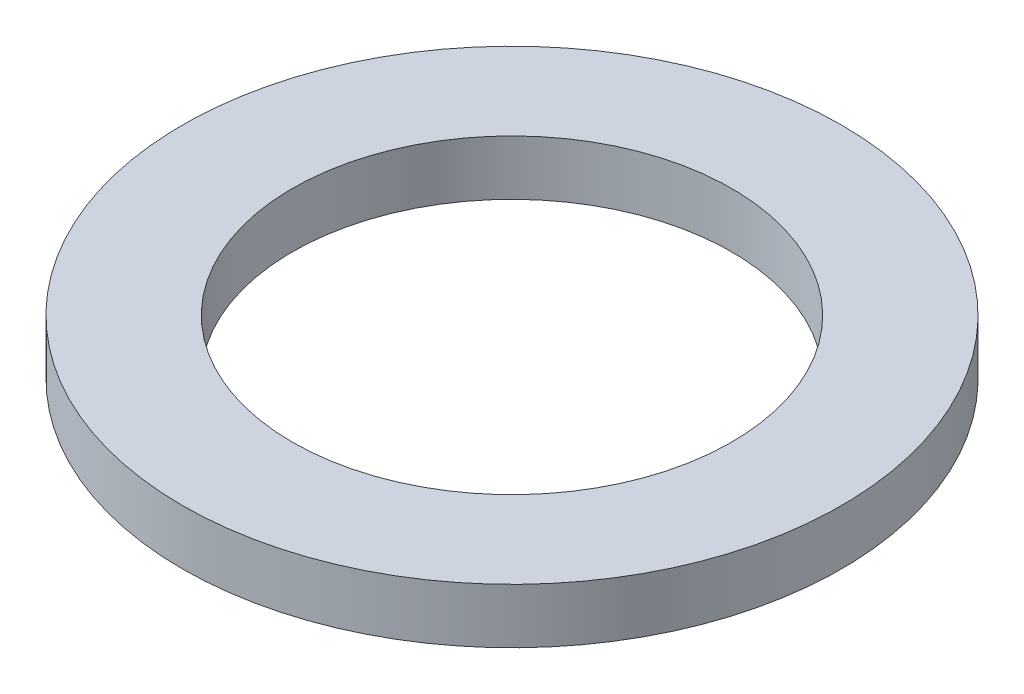
ISO-10303-21;
HEADER;
FILE_DESCRIPTION(('STEP AP214'),'2;1');
FILE_NAME('part.step','',(''),(''),'','','');
FILE_SCHEMA(('AUTOMOTIVE_DESIGN { 1 0 10303 214 1 1 1 1 }'));
ENDSEC;
DATA;
#1=APPLICATION_CONTEXT('core data for automotive mechanical design processes');
#2=APPLICATION_PROTOCOL_DEFINITION('international standard','automotive_design',2000,#1);
#3=PRODUCT_CONTEXT('',#1,'mechanical');
#4=PRODUCT('Part','Part','',(#3));
#5=PRODUCT_RELATED_PRODUCT_CATEGORY('part','',(#4));
#6=PRODUCT_DEFINITION_FORMATION('','',#4);
#7=PRODUCT_DEFINITION_CONTEXT('part definition',#1,'design');
#8=PRODUCT_DEFINITION('design','',#6,#7);
#9=PRODUCT_DEFINITION_SHAPE('','',#8);
#10=(LENGTH_UNIT() NAMED_UNIT(*) SI_UNIT(.MILLI.,.METRE.));
#11=(NAMED_UNIT(*) PLANE_ANGLE_UNIT() SI_UNIT($,.RADIAN.));
#12=(NAMED_UNIT(*) SI_UNIT($,.STERADIAN.) SOLID_ANGLE_UNIT());
#13=UNCERTAINTY_MEASURE_WITH_UNIT(LENGTH_MEASURE(1.E-05),#10,'distance_accuracy_value','');
#14=(GEOMETRIC_REPRESENTATION_CONTEXT(3) GLOBAL_UNCERTAINTY_ASSIGNED_CONTEXT((#13)) GLOBAL_UNIT_ASSIGNED_CONTEXT((#10,
#11,#12)) REPRESENTATION_CONTEXT('',''));
#15=CARTESIAN_POINT('',(0.,0.,0.));
#16=DIRECTION('',(0.,0.,1.));
#17=DIRECTION('',(1.,0.,0.));
#18=AXIS2_PLACEMENT_3D('',#15,#16,#17);
#19=CARTESIAN_POINT('',(0.,5.,0.));
#20=DIRECTION('',(0.,1.,0.));
#21=DIRECTION('',(0.,0.,1.));
#22=AXIS2_PLACEMENT_3D('',#19,#20,#21);
#23=PLANE('',#22);
#24=CARTESIAN_POINT('',(0.,5.,0.));
#25=DIRECTION('',(0.,1.,0.));
#26=DIRECTION('',(0.,0.,1.));
#27=AXIS2_PLACEMENT_3D('',#24,#25,#26);
#28=CIRCLE('',#27,30.);
#29=CARTESIAN_POINT('',(0.,5.,30.));
#30=VERTEX_POINT('',#29);
#31=EDGE_CURVE('E10',#30,#30,#28,.T.);
#32=ORIENTED_EDGE('',*,*,#31,.T.);
#33=EDGE_LOOP('',(#32));
#34=FACE_BOUND('',#33,.T.);
#35=CARTESIAN_POINT('',(0.,5.,0.));
#36=DIRECTION('',(0.,1.,0.));
#37=DIRECTION('',(0.,0.,1.));
#38=AXIS2_PLACEMENT_3D('',#35,#36,#37);
#39=CIRCLE('',#38,20.);
#40=CARTESIAN_POINT('',(0.,5.,20.));
#41=VERTEX_POINT('',#40);
#42=EDGE_CURVE('E53',#41,#41,#39,.T.);
#43=ORIENTED_EDGE('',*,*,#42,.F.);
#44=EDGE_LOOP('',(#43));
#45=FACE_BOUND('',#44,.T.);
#46=ADVANCED_FACE('F40',(#34,#45),#23,.T.);
#47=CARTESIAN_POINT('',(0.,0.,0.));
#48=DIRECTION('',(0.,1.,0.));
#49=DIRECTION('',(0.,0.,1.));
#50=AXIS2_PLACEMENT_3D('',#47,#48,#49);
#51=PLANE('',#50);
#52=CARTESIAN_POINT('',(0.,0.,0.));
#53=DIRECTION('',(0.,1.,0.));
#54=DIRECTION('',(0.,0.,1.));
#55=AXIS2_PLACEMENT_3D('',#52,#53,#54);
#56=CIRCLE('',#55,30.);
#57=CARTESIAN_POINT('',(0.,0.,30.));
#58=VERTEX_POINT('',#57);
#59=EDGE_CURVE('E44',#58,#58,#56,.T.);
#60=ORIENTED_EDGE('',*,*,#59,.F.);
#61=EDGE_LOOP('',(#60));
#62=FACE_BOUND('',#61,.T.);
#63=CARTESIAN_POINT('',(0.,0.,0.));
#64=DIRECTION('',(0.,1.,0.));
#65=DIRECTION('',(0.,0.,1.));
#66=AXIS2_PLACEMENT_3D('',#63,#64,#65);
#67=CIRCLE('',#66,20.);
#68=CARTESIAN_POINT('',(0.,0.,20.));
#69=VERTEX_POINT('',#68);
#70=EDGE_CURVE('E55',#69,#69,#67,.T.);
#71=ORIENTED_EDGE('',*,*,#70,.T.);
#72=EDGE_LOOP('',(#71));
#73=FACE_BOUND('',#72,.T.);
#74=ADVANCED_FACE('F67',(#62,#73),#51,.F.);
#75=CARTESIAN_POINT('',(0.,5.,0.));
#76=DIRECTION('',(0.,-1.,0.));
#77=DIRECTION('',(0.,0.,-1.));
#78=AXIS2_PLACEMENT_3D('',#75,#76,#77);
#79=CYLINDRICAL_SURFACE('',#78,30.);
#80=ORIENTED_EDGE('',*,*,#31,.F.);
#81=EDGE_LOOP('',(#80));
#82=FACE_BOUND('',#81,.T.);
#83=ORIENTED_EDGE('',*,*,#59,.T.);
#84=EDGE_LOOP('',(#83));
#85=FACE_BOUND('',#84,.T.);
#86=ADVANCED_FACE('F42',(#82,#85),#79,.T.);
#87=CARTESIAN_POINT('',(0.,5.,0.));
#88=DIRECTION('',(0.,-1.,0.));
#89=DIRECTION('',(0.,0.,-1.));
#90=AXIS2_PLACEMENT_3D('',#87,#88,#89);
#91=CYLINDRICAL_SURFACE('',#90,20.);
#92=ORIENTED_EDGE('',*,*,#42,.T.);
#93=EDGE_LOOP('',(#92));
#94=FACE_BOUND('',#93,.T.);
#95=ORIENTED_EDGE('',*,*,#70,.F.);
#96=EDGE_LOOP('',(#95));
#97=FACE_BOUND('',#96,.T.);
#98=ADVANCED_FACE('F63',(#94,#97),#91,.F.);
#99=CLOSED_SHELL('',(#46,#74,#86,#98));
#100=MANIFOLD_SOLID_BREP('B2',#99);
#101=ADVANCED_BREP_SHAPE_REPRESENTATION('',(#18,#100),#14);
#102=SHAPE_DEFINITION_REPRESENTATION(#9,#101);
ENDSEC;
END-ISO-10303-21;
